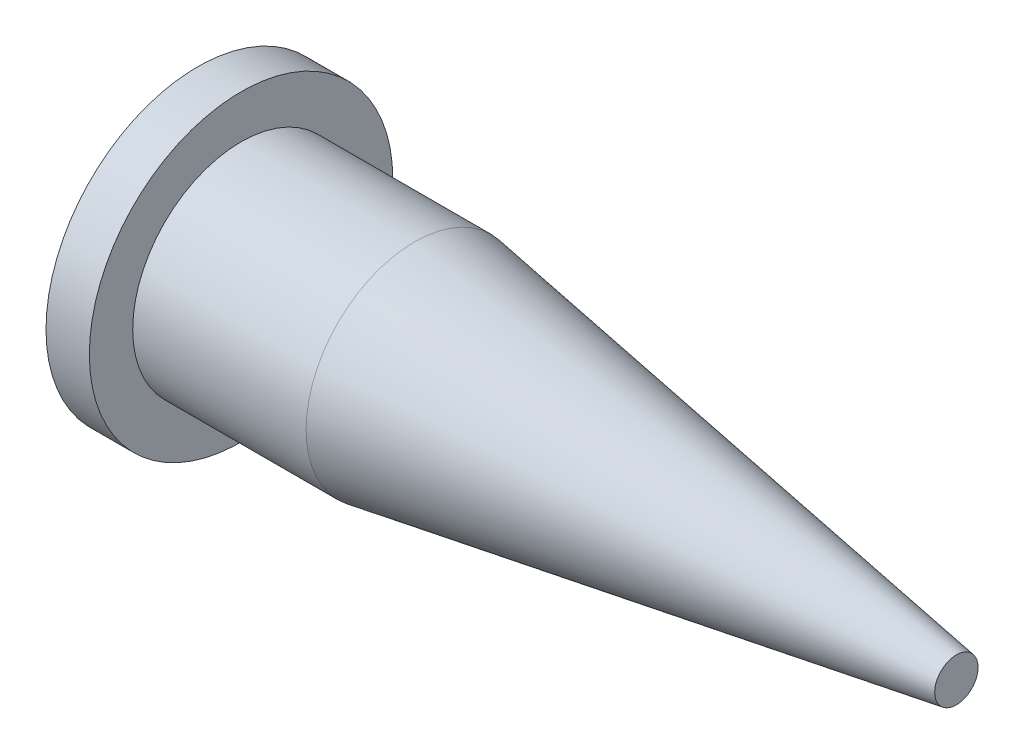
ISO-10303-21;
HEADER;
FILE_DESCRIPTION(('STEP AP214'),'2;1');
FILE_NAME('part.step','',(''),(''),'','','');
FILE_SCHEMA(('AUTOMOTIVE_DESIGN { 1 0 10303 214 1 1 1 1 }'));
ENDSEC;
DATA;
#1=APPLICATION_CONTEXT('core data for automotive mechanical design processes');
#2=APPLICATION_PROTOCOL_DEFINITION('international standard','automotive_design',2000,#1);
#3=PRODUCT_CONTEXT('',#1,'mechanical');
#4=PRODUCT('Part','Part','',(#3));
#5=PRODUCT_RELATED_PRODUCT_CATEGORY('part','',(#4));
#6=PRODUCT_DEFINITION_FORMATION('','',#4);
#7=PRODUCT_DEFINITION_CONTEXT('part definition',#1,'design');
#8=PRODUCT_DEFINITION('design','',#6,#7);
#9=PRODUCT_DEFINITION_SHAPE('','',#8);
#10=(LENGTH_UNIT() NAMED_UNIT(*) SI_UNIT(.MILLI.,.METRE.));
#11=(NAMED_UNIT(*) PLANE_ANGLE_UNIT() SI_UNIT($,.RADIAN.));
#12=(NAMED_UNIT(*) SI_UNIT($,.STERADIAN.) SOLID_ANGLE_UNIT());
#13=UNCERTAINTY_MEASURE_WITH_UNIT(LENGTH_MEASURE(1.E-05),#10,'distance_accuracy_value','');
#14=(GEOMETRIC_REPRESENTATION_CONTEXT(3) GLOBAL_UNCERTAINTY_ASSIGNED_CONTEXT((#13)) GLOBAL_UNIT_ASSIGNED_CONTEXT((#10,
#11,#12)) REPRESENTATION_CONTEXT('',''));
#15=CARTESIAN_POINT('',(0.,0.,0.));
#16=DIRECTION('',(0.,0.,1.));
#17=DIRECTION('',(1.,0.,0.));
#18=AXIS2_PLACEMENT_3D('',#15,#16,#17);
#19=CARTESIAN_POINT('',(-10.8785046728972,0.,2.18691588785046));
#20=DIRECTION('',(-1.,0.,0.));
#21=DIRECTION('',(0.,0.,1.));
#22=AXIS2_PLACEMENT_3D('',#19,#20,#21);
#23=CYLINDRICAL_SURFACE('',#22,7.);
#24=CARTESIAN_POINT('',(-10.8785046728972,0.,2.18691588785046));
#25=DIRECTION('',(-1.,0.,0.));
#26=DIRECTION('',(0.,0.,1.));
#27=AXIS2_PLACEMENT_3D('',#24,#25,#26);
#28=CIRCLE('',#27,7.);
#29=CARTESIAN_POINT('',(-10.8785046728972,0.,9.18691588785047));
#30=VERTEX_POINT('',#29);
#31=EDGE_CURVE('E57',#30,#30,#28,.T.);
#32=ORIENTED_EDGE('',*,*,#31,.F.);
#33=EDGE_LOOP('',(#32));
#34=FACE_BOUND('',#33,.T.);
#35=CARTESIAN_POINT('',(-8.87850467289719,0.,2.18691588785046));
#36=DIRECTION('',(-1.,0.,0.));
#37=DIRECTION('',(0.,0.,1.));
#38=AXIS2_PLACEMENT_3D('',#35,#36,#37);
#39=CIRCLE('',#38,7.);
#40=CARTESIAN_POINT('',(-8.87850467289719,0.,9.18691588785047));
#41=VERTEX_POINT('',#40);
#42=EDGE_CURVE('E10',#41,#41,#39,.T.);
#43=ORIENTED_EDGE('',*,*,#42,.T.);
#44=EDGE_LOOP('',(#43));
#45=FACE_BOUND('',#44,.T.);
#46=ADVANCED_FACE('F40',(#34,#45),#23,.T.);
#47=CARTESIAN_POINT('',(-8.87850467289719,0.,-4.81308411214954));
#48=DIRECTION('',(-1.,0.,0.));
#49=DIRECTION('',(0.,0.,1.));
#50=AXIS2_PLACEMENT_3D('',#47,#48,#49);
#51=PLANE('',#50);
#52=ORIENTED_EDGE('',*,*,#42,.F.);
#53=EDGE_LOOP('',(#52));
#54=FACE_BOUND('',#53,.T.);
#55=CARTESIAN_POINT('',(-8.87850467289719,0.,2.18691588785046));
#56=DIRECTION('',(-1.,0.,0.));
#57=DIRECTION('',(0.,0.,1.));
#58=AXIS2_PLACEMENT_3D('',#55,#56,#57);
#59=CIRCLE('',#58,5.);
#60=CARTESIAN_POINT('',(-8.87850467289719,0.,7.18691588785046));
#61=VERTEX_POINT('',#60);
#62=EDGE_CURVE('E43',#61,#61,#59,.T.);
#63=ORIENTED_EDGE('',*,*,#62,.T.);
#64=EDGE_LOOP('',(#63));
#65=FACE_BOUND('',#64,.T.);
#66=ADVANCED_FACE('F65',(#54,#65),#51,.F.);
#67=CARTESIAN_POINT('',(-10.8785046728972,0.,2.18691588785046));
#68=DIRECTION('',(-1.,0.,0.));
#69=DIRECTION('',(0.,0.,1.));
#70=AXIS2_PLACEMENT_3D('',#67,#68,#69);
#71=CYLINDRICAL_SURFACE('',#70,5.);
#72=ORIENTED_EDGE('',*,*,#62,.F.);
#73=EDGE_LOOP('',(#72));
#74=FACE_BOUND('',#73,.T.);
#75=CARTESIAN_POINT('',(-0.878504672897191,0.,2.18691588785046));
#76=DIRECTION('',(-1.,0.,0.));
#77=DIRECTION('',(0.,0.,1.));
#78=AXIS2_PLACEMENT_3D('',#75,#76,#77);
#79=CIRCLE('',#78,5.);
#80=CARTESIAN_POINT('',(-0.878504672897191,0.,7.18691588785046));
#81=VERTEX_POINT('',#80);
#82=EDGE_CURVE('E50',#81,#81,#79,.T.);
#83=ORIENTED_EDGE('',*,*,#82,.T.);
#84=EDGE_LOOP('',(#83));
#85=FACE_BOUND('',#84,.T.);
#86=ADVANCED_FACE('F70',(#74,#85),#71,.T.);
#87=CARTESIAN_POINT('',(24.1214953271028,0.,2.18691588785046));
#88=DIRECTION('',(-1.,0.,0.));
#89=DIRECTION('',(0.,0.,1.));
#90=AXIS2_PLACEMENT_3D('',#87,#88,#89);
#91=CONICAL_SURFACE('',#90,1.,0.158655262186401);
#92=CARTESIAN_POINT('',(24.1214953271028,0.,2.18691588785046));
#93=DIRECTION('',(-1.,0.,0.));
#94=DIRECTION('',(0.,0.,1.));
#95=AXIS2_PLACEMENT_3D('',#92,#93,#94);
#96=CIRCLE('',#95,1.);
#97=CARTESIAN_POINT('',(24.1214953271028,0.,3.18691588785046));
#98=VERTEX_POINT('',#97);
#99=EDGE_CURVE('E51',#98,#98,#96,.T.);
#100=CARTESIAN_POINT('',(-0.878504672897191,0.,7.18691588785046));
#101=CARTESIAN_POINT('',(-0.618088006230525,0.,7.1452492211838));
#102=CARTESIAN_POINT('',(-0.357671339563858,0.,7.10358255451713));
#103=CARTESIAN_POINT('',(0.163161993769476,0.,7.0202492211838));
#104=CARTESIAN_POINT('',(0.423578660436143,0.,6.97858255451713));
#105=CARTESIAN_POINT('',(0.944411993769476,0.,6.8952492211838));
#106=CARTESIAN_POINT('',(1.20482866043614,0.,6.85358255451713));
#107=CARTESIAN_POINT('',(1.72566199376947,0.,6.7702492211838));
#108=CARTESIAN_POINT('',(1.98607866043614,0.,6.72858255451713));
#109=CARTESIAN_POINT('',(2.50691199376947,0.,6.6452492211838));
#110=CARTESIAN_POINT('',(2.76732866043614,0.,6.60358255451713));
#111=CARTESIAN_POINT('',(3.28816199376948,0.,6.5202492211838));
#112=CARTESIAN_POINT('',(3.54857866043614,0.,6.47858255451713));
#113=CARTESIAN_POINT('',(4.06941199376948,0.,6.3952492211838));
#114=CARTESIAN_POINT('',(4.32982866043614,0.,6.35358255451713));
#115=CARTESIAN_POINT('',(4.85066199376948,0.,6.2702492211838));
#116=CARTESIAN_POINT('',(5.11107866043614,0.,6.22858255451713));
#117=CARTESIAN_POINT('',(5.63191199376948,0.,6.1452492211838));
#118=CARTESIAN_POINT('',(5.89232866043614,0.,6.10358255451713));
#119=CARTESIAN_POINT('',(6.41316199376948,0.,6.0202492211838));
#120=CARTESIAN_POINT('',(6.67357866043614,0.,5.97858255451713));
#121=CARTESIAN_POINT('',(7.19441199376948,0.,5.8952492211838));
#122=CARTESIAN_POINT('',(7.45482866043614,0.,5.85358255451713));
#123=CARTESIAN_POINT('',(7.97566199376948,0.,5.7702492211838));
#124=CARTESIAN_POINT('',(8.23607866043614,0.,5.72858255451713));
#125=CARTESIAN_POINT('',(8.75691199376948,0.,5.6452492211838));
#126=CARTESIAN_POINT('',(9.01732866043614,0.,5.60358255451713));
#127=CARTESIAN_POINT('',(9.53816199376948,0.,5.5202492211838));
#128=CARTESIAN_POINT('',(9.79857866043614,0.,5.47858255451713));
#129=CARTESIAN_POINT('',(10.3194119937695,0.,5.3952492211838));
#130=CARTESIAN_POINT('',(10.5798286604361,0.,5.35358255451713));
#131=CARTESIAN_POINT('',(11.1006619937695,0.,5.2702492211838));
#132=CARTESIAN_POINT('',(11.3610786604361,0.,5.22858255451713));
#133=CARTESIAN_POINT('',(11.8819119937695,0.,5.1452492211838));
#134=CARTESIAN_POINT('',(12.1423286604361,0.,5.10358255451713));
#135=CARTESIAN_POINT('',(12.6631619937695,0.,5.0202492211838));
#136=CARTESIAN_POINT('',(12.9235786604361,0.,4.97858255451713));
#137=CARTESIAN_POINT('',(13.4444119937695,0.,4.8952492211838));
#138=CARTESIAN_POINT('',(13.7048286604361,0.,4.85358255451713));
#139=CARTESIAN_POINT('',(14.2256619937695,0.,4.7702492211838));
#140=CARTESIAN_POINT('',(14.4860786604361,0.,4.72858255451713));
#141=CARTESIAN_POINT('',(15.0069119937695,0.,4.6452492211838));
#142=CARTESIAN_POINT('',(15.2673286604361,0.,4.60358255451713));
#143=CARTESIAN_POINT('',(15.7881619937695,0.,4.5202492211838));
#144=CARTESIAN_POINT('',(16.0485786604361,0.,4.47858255451713));
#145=CARTESIAN_POINT('',(16.5694119937695,0.,4.3952492211838));
#146=CARTESIAN_POINT('',(16.8298286604361,0.,4.35358255451713));
#147=CARTESIAN_POINT('',(17.3506619937695,0.,4.2702492211838));
#148=CARTESIAN_POINT('',(17.6110786604361,0.,4.22858255451713));
#149=CARTESIAN_POINT('',(18.1319119937695,0.,4.1452492211838));
#150=CARTESIAN_POINT('',(18.3923286604361,0.,4.10358255451713));
#151=CARTESIAN_POINT('',(18.9131619937695,0.,4.0202492211838));
#152=CARTESIAN_POINT('',(19.1735786604361,0.,3.97858255451713));
#153=CARTESIAN_POINT('',(19.6944119937695,0.,3.8952492211838));
#154=CARTESIAN_POINT('',(19.9548286604361,0.,3.85358255451713));
#155=CARTESIAN_POINT('',(20.4756619937695,0.,3.7702492211838));
#156=CARTESIAN_POINT('',(20.7360786604361,0.,3.72858255451713));
#157=CARTESIAN_POINT('',(21.2569119937695,0.,3.6452492211838));
#158=CARTESIAN_POINT('',(21.5173286604361,0.,3.60358255451713));
#159=CARTESIAN_POINT('',(22.0381619937695,0.,3.5202492211838));
#160=CARTESIAN_POINT('',(22.2985786604361,0.,3.47858255451713));
#161=CARTESIAN_POINT('',(22.8194119937695,0.,3.3952492211838));
#162=CARTESIAN_POINT('',(23.0798286604361,0.,3.35358255451713));
#163=CARTESIAN_POINT('',(23.6006619937695,0.,3.2702492211838));
#164=CARTESIAN_POINT('',(23.8610786604361,0.,3.22858255451713));
#165=CARTESIAN_POINT('',(24.1214953271028,0.,3.18691588785046));
#166=B_SPLINE_CURVE_WITH_KNOTS('',3,(#100,#101,#102,#103,#104,#105,#106,#107,#108,#109,#110,
#111,#112,#113,#114,#115,#116,#117,#118,#119,#120,#121,#122,#123,#124,#125,#126,#127,#128,#129,
#130,#131,#132,#133,#134,#135,#136,#137,#138,#139,#140,#141,#142,#143,#144,#145,#146,#147,#148,
#149,#150,#151,#152,#153,#154,#155,#156,#157,#158,#159,#160,#161,#162,#163,#164,#165),
.UNSPECIFIED.,.F.,.F.,(4,2,2,2,2,2,2,2,2,2,2,2,2,2,2,2,2,2,2,2,2,2,2,2,2,2,2,2,2,2,2,2,4),(0.,
0.791186806323261,1.58237361264652,2.37356041896978,3.16474722529304,3.9559340316163,
4.74712083793956,5.53830764426282,6.32949445058608,7.12068125690934,7.9118680632326,
8.70305486955587,9.49424167587912,10.2854284822024,11.0766152885256,11.8678020948489,
12.6589889011722,13.4501757074954,14.2413625138187,15.0325493201419,15.8237361264652,
16.6149229327885,17.4061097391117,18.197296545435,18.9884833517582,19.7796701580815,
20.5708569644048,21.362043770728,22.1532305770513,22.9444173833745,23.7356041896978,
24.5267909960211,25.3179778023443),.UNSPECIFIED.);
#167=EDGE_CURVE('BSEAM74',#81,#98,#166,.T.);
#168=ORIENTED_EDGE('',*,*,#82,.F.);
#169=ORIENTED_EDGE('',*,*,#99,.T.);
#170=ORIENTED_EDGE('',*,*,#167,.T.);
#171=ORIENTED_EDGE('',*,*,#167,.F.);
#172=EDGE_LOOP('',(#168,#170,#169,#171));
#173=FACE_BOUND('',#172,.T.);
#174=ADVANCED_FACE('F74',(#173),#91,.T.);
#175=CARTESIAN_POINT('',(24.1214953271028,0.,1.18691588785046));
#176=DIRECTION('',(-1.,0.,0.));
#177=DIRECTION('',(0.,0.,1.));
#178=AXIS2_PLACEMENT_3D('',#175,#176,#177);
#179=PLANE('',#178);
#180=ORIENTED_EDGE('',*,*,#99,.F.);
#181=EDGE_LOOP('',(#180));
#182=FACE_BOUND('',#181,.T.);
#183=ADVANCED_FACE('F76',(#182),#179,.F.);
#184=CARTESIAN_POINT('',(-10.8785046728972,0.,-4.81308411214954));
#185=DIRECTION('',(1.,0.,0.));
#186=DIRECTION('',(0.,0.,-1.));
#187=AXIS2_PLACEMENT_3D('',#184,#185,#186);
#188=PLANE('',#187);
#189=ORIENTED_EDGE('',*,*,#31,.T.);
#190=EDGE_LOOP('',(#189));
#191=FACE_BOUND('',#190,.T.);
#192=ADVANCED_FACE('F58',(#191),#188,.F.);
#193=CLOSED_SHELL('',(#46,#66,#86,#174,#183,#192));
#194=MANIFOLD_SOLID_BREP('B2',#193);
#195=ADVANCED_BREP_SHAPE_REPRESENTATION('',(#18,#194),#14);
#196=SHAPE_DEFINITION_REPRESENTATION(#9,#195);
ENDSEC;
END-ISO-10303-21;
